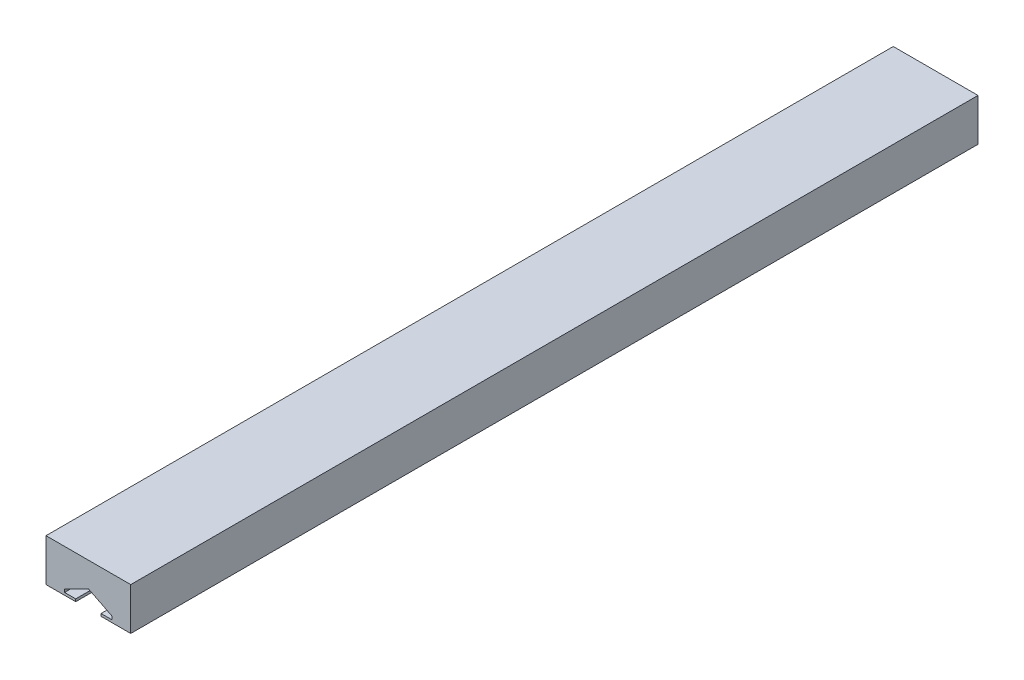
ISO-10303-21;
HEADER;
FILE_DESCRIPTION(('STEP AP214'),'2;1');
FILE_NAME('part.step','',(''),(''),'','','');
FILE_SCHEMA(('AUTOMOTIVE_DESIGN { 1 0 10303 214 1 1 1 1 }'));
ENDSEC;
DATA;
#1=APPLICATION_CONTEXT('core data for automotive mechanical design processes');
#2=APPLICATION_PROTOCOL_DEFINITION('international standard','automotive_design',2000,#1);
#3=PRODUCT_CONTEXT('',#1,'mechanical');
#4=PRODUCT('Part','Part','',(#3));
#5=PRODUCT_RELATED_PRODUCT_CATEGORY('part','',(#4));
#6=PRODUCT_DEFINITION_FORMATION('','',#4);
#7=PRODUCT_DEFINITION_CONTEXT('part definition',#1,'design');
#8=PRODUCT_DEFINITION('design','',#6,#7);
#9=PRODUCT_DEFINITION_SHAPE('','',#8);
#10=(LENGTH_UNIT() NAMED_UNIT(*) SI_UNIT(.MILLI.,.METRE.));
#11=(NAMED_UNIT(*) PLANE_ANGLE_UNIT() SI_UNIT($,.RADIAN.));
#12=(NAMED_UNIT(*) SI_UNIT($,.STERADIAN.) SOLID_ANGLE_UNIT());
#13=UNCERTAINTY_MEASURE_WITH_UNIT(LENGTH_MEASURE(1.E-05),#10,'distance_accuracy_value','');
#14=(GEOMETRIC_REPRESENTATION_CONTEXT(3) GLOBAL_UNCERTAINTY_ASSIGNED_CONTEXT((#13)) GLOBAL_UNIT_ASSIGNED_CONTEXT((#10,
#11,#12)) REPRESENTATION_CONTEXT('',''));
#15=CARTESIAN_POINT('',(0.,0.,0.));
#16=DIRECTION('',(0.,0.,1.));
#17=DIRECTION('',(1.,0.,0.));
#18=AXIS2_PLACEMENT_3D('',#15,#16,#17);
#19=CARTESIAN_POINT('',(-10.,-5.,200.));
#20=DIRECTION('',(1.,0.,0.));
#21=DIRECTION('',(0.,1.,0.));
#22=AXIS2_PLACEMENT_3D('',#19,#20,#21);
#23=PLANE('',#22);
#24=DIRECTION('',(0.,-1.,0.));
#25=VECTOR('',#24,1.);
#26=CARTESIAN_POINT('',(-10.,-5.,0.));
#27=LINE('',#26,#25);
#28=CARTESIAN_POINT('',(-10.,5.,0.));
#29=VERTEX_POINT('',#28);
#30=CARTESIAN_POINT('',(-10.,-5.,0.));
#31=VERTEX_POINT('',#30);
#32=EDGE_CURVE('E170',#29,#31,#27,.T.);
#33=ORIENTED_EDGE('',*,*,#32,.T.);
#34=DIRECTION('',(0.,0.,-1.));
#35=VECTOR('',#34,1.);
#36=CARTESIAN_POINT('',(-10.,-5.,200.));
#37=LINE('',#36,#35);
#38=CARTESIAN_POINT('',(-10.,-5.,200.));
#39=VERTEX_POINT('',#38);
#40=EDGE_CURVE('E11',#39,#31,#37,.T.);
#41=ORIENTED_EDGE('',*,*,#40,.F.);
#42=DIRECTION('',(0.,-1.,0.));
#43=VECTOR('',#42,1.);
#44=CARTESIAN_POINT('',(-10.,-5.,200.));
#45=LINE('',#44,#43);
#46=CARTESIAN_POINT('',(-10.,5.,200.));
#47=VERTEX_POINT('',#46);
#48=EDGE_CURVE('E207',#47,#39,#45,.T.);
#49=ORIENTED_EDGE('',*,*,#48,.F.);
#50=DIRECTION('',(0.,0.,-1.));
#51=VECTOR('',#50,1.);
#52=CARTESIAN_POINT('',(-10.,5.,200.));
#53=LINE('',#52,#51);
#54=EDGE_CURVE('E166',#47,#29,#53,.T.);
#55=ORIENTED_EDGE('',*,*,#54,.T.);
#56=EDGE_LOOP('',(#33,#41,#49,#55));
#57=FACE_BOUND('',#56,.T.);
#58=ADVANCED_FACE('F39',(#57),#23,.F.);
#59=CARTESIAN_POINT('',(-2.99117325571684,-5.,200.));
#60=DIRECTION('',(0.,1.,0.));
#61=DIRECTION('',(-1.,0.,0.));
#62=AXIS2_PLACEMENT_3D('',#59,#60,#61);
#63=PLANE('',#62);
#64=DIRECTION('',(1.,0.,0.));
#65=VECTOR('',#64,1.);
#66=CARTESIAN_POINT('',(-2.99117325571684,-5.,0.));
#67=LINE('',#66,#65);
#68=CARTESIAN_POINT('',(-2.99117325571684,-5.,0.));
#69=VERTEX_POINT('',#68);
#70=EDGE_CURVE('E174',#31,#69,#67,.T.);
#71=ORIENTED_EDGE('',*,*,#70,.T.);
#72=DIRECTION('',(0.,0.,-1.));
#73=VECTOR('',#72,1.);
#74=CARTESIAN_POINT('',(-2.99117325571684,-5.,200.));
#75=LINE('',#74,#73);
#76=CARTESIAN_POINT('',(-2.99117325571684,-5.,200.));
#77=VERTEX_POINT('',#76);
#78=EDGE_CURVE('E48',#77,#69,#75,.T.);
#79=ORIENTED_EDGE('',*,*,#78,.F.);
#80=DIRECTION('',(1.,0.,0.));
#81=VECTOR('',#80,1.);
#82=CARTESIAN_POINT('',(-2.99117325571684,-5.,200.));
#83=LINE('',#82,#81);
#84=EDGE_CURVE('E114',#39,#77,#83,.T.);
#85=ORIENTED_EDGE('',*,*,#84,.F.);
#86=ORIENTED_EDGE('',*,*,#40,.T.);
#87=EDGE_LOOP('',(#71,#79,#85,#86));
#88=FACE_BOUND('',#87,.T.);
#89=ADVANCED_FACE('F308',(#88),#63,.F.);
#90=CARTESIAN_POINT('',(-2.99117325571684,-5.,200.));
#91=DIRECTION('',(-1.,0.,0.));
#92=DIRECTION('',(0.,0.,1.));
#93=AXIS2_PLACEMENT_3D('',#90,#91,#92);
#94=PLANE('',#93);
#95=DIRECTION('',(0.,1.,0.));
#96=VECTOR('',#95,1.);
#97=CARTESIAN_POINT('',(-2.99117325571684,-5.,0.));
#98=LINE('',#97,#96);
#99=CARTESIAN_POINT('',(-2.99117325571684,-4.4150657523741,0.));
#100=VERTEX_POINT('',#99);
#101=EDGE_CURVE('E177',#69,#100,#98,.T.);
#102=ORIENTED_EDGE('',*,*,#101,.T.);
#103=DIRECTION('',(0.,0.,-1.));
#104=VECTOR('',#103,1.);
#105=CARTESIAN_POINT('',(-2.99117325571684,-4.4150657523741,200.));
#106=LINE('',#105,#104);
#107=CARTESIAN_POINT('',(-2.99117325571684,-4.4150657523741,200.));
#108=VERTEX_POINT('',#107);
#109=EDGE_CURVE('E238',#108,#100,#106,.T.);
#110=ORIENTED_EDGE('',*,*,#109,.F.);
#111=DIRECTION('',(0.,1.,0.));
#112=VECTOR('',#111,1.);
#113=CARTESIAN_POINT('',(-2.99117325571684,-5.,200.));
#114=LINE('',#113,#112);
#115=EDGE_CURVE('E248',#77,#108,#114,.T.);
#116=ORIENTED_EDGE('',*,*,#115,.F.);
#117=ORIENTED_EDGE('',*,*,#78,.T.);
#118=EDGE_LOOP('',(#102,#110,#116,#117));
#119=FACE_BOUND('',#118,.T.);
#120=ADVANCED_FACE('F246',(#119),#94,.F.);
#121=CARTESIAN_POINT('',(-2.99117325571684,-4.4150657523741,200.));
#122=DIRECTION('',(0.,-1.,0.));
#123=DIRECTION('',(0.,0.,-1.));
#124=AXIS2_PLACEMENT_3D('',#121,#122,#123);
#125=PLANE('',#124);
#126=DIRECTION('',(-1.,0.,0.));
#127=VECTOR('',#126,1.);
#128=CARTESIAN_POINT('',(-2.99117325571684,-4.4150657523741,0.));
#129=LINE('',#128,#127);
#130=CARTESIAN_POINT('',(-5.6161355472875,-4.4150657523741,0.));
#131=VERTEX_POINT('',#130);
#132=EDGE_CURVE('E180',#100,#131,#129,.T.);
#133=ORIENTED_EDGE('',*,*,#132,.T.);
#134=DIRECTION('',(0.,0.,-1.));
#135=VECTOR('',#134,1.);
#136=CARTESIAN_POINT('',(-5.6161355472875,-4.4150657523741,200.));
#137=LINE('',#136,#135);
#138=CARTESIAN_POINT('',(-5.6161355472875,-4.4150657523741,200.));
#139=VERTEX_POINT('',#138);
#140=EDGE_CURVE('E234',#139,#131,#137,.T.);
#141=ORIENTED_EDGE('',*,*,#140,.F.);
#142=DIRECTION('',(-1.,0.,0.));
#143=VECTOR('',#142,1.);
#144=CARTESIAN_POINT('',(-2.99117325571684,-4.4150657523741,200.));
#145=LINE('',#144,#143);
#146=EDGE_CURVE('E267',#108,#139,#145,.T.);
#147=ORIENTED_EDGE('',*,*,#146,.F.);
#148=ORIENTED_EDGE('',*,*,#109,.T.);
#149=EDGE_LOOP('',(#133,#141,#147,#148));
#150=FACE_BOUND('',#149,.T.);
#151=ADVANCED_FACE('F257',(#150),#125,.F.);
#152=CARTESIAN_POINT('',(-5.6161355472875,-4.4150657523741,200.));
#153=DIRECTION('',(-1.,0.,0.));
#154=DIRECTION('',(0.,-1.,0.));
#155=AXIS2_PLACEMENT_3D('',#152,#153,#154);
#156=PLANE('',#155);
#157=DIRECTION('',(0.,1.,0.));
#158=VECTOR('',#157,1.);
#159=CARTESIAN_POINT('',(-5.6161355472875,-4.4150657523741,0.));
#160=LINE('',#159,#158);
#161=CARTESIAN_POINT('',(-5.6161355472875,-3.66682754740484,0.));
#162=VERTEX_POINT('',#161);
#163=EDGE_CURVE('E183',#131,#162,#160,.T.);
#164=ORIENTED_EDGE('',*,*,#163,.T.);
#165=DIRECTION('',(0.,0.,-1.));
#166=VECTOR('',#165,1.);
#167=CARTESIAN_POINT('',(-5.6161355472875,-3.66682754740484,200.));
#168=LINE('',#167,#166);
#169=CARTESIAN_POINT('',(-5.6161355472875,-3.66682754740484,200.));
#170=VERTEX_POINT('',#169);
#171=EDGE_CURVE('E230',#170,#162,#168,.T.);
#172=ORIENTED_EDGE('',*,*,#171,.F.);
#173=DIRECTION('',(0.,1.,0.));
#174=VECTOR('',#173,1.);
#175=CARTESIAN_POINT('',(-5.6161355472875,-4.4150657523741,200.));
#176=LINE('',#175,#174);
#177=EDGE_CURVE('E263',#139,#170,#176,.T.);
#178=ORIENTED_EDGE('',*,*,#177,.F.);
#179=ORIENTED_EDGE('',*,*,#140,.T.);
#180=EDGE_LOOP('',(#164,#172,#178,#179));
#181=FACE_BOUND('',#180,.T.);
#182=ADVANCED_FACE('F261',(#181),#156,.F.);
#183=CARTESIAN_POINT('',(-5.6161355472875,-3.66682754740484,200.));
#184=DIRECTION('',(-0.447213595499958,0.894427190999916,0.));
#185=DIRECTION('',(-0.894427190999916,-0.447213595499958,0.));
#186=AXIS2_PLACEMENT_3D('',#183,#184,#185);
#187=PLANE('',#186);
#188=DIRECTION('',(0.894427190999916,0.447213595499958,0.));
#189=VECTOR('',#188,1.);
#190=CARTESIAN_POINT('',(-5.6161355472875,-3.66682754740484,0.));
#191=LINE('',#190,#189);
#192=CARTESIAN_POINT('',(0.,-0.858759773761084,0.));
#193=VERTEX_POINT('',#192);
#194=EDGE_CURVE('E186',#162,#193,#191,.T.);
#195=ORIENTED_EDGE('',*,*,#194,.T.);
#196=DIRECTION('',(0.,0.,-1.));
#197=VECTOR('',#196,1.);
#198=CARTESIAN_POINT('',(0.,-0.858759773761084,200.));
#199=LINE('',#198,#197);
#200=CARTESIAN_POINT('',(0.,-0.858759773761084,200.));
#201=VERTEX_POINT('',#200);
#202=EDGE_CURVE('E226',#201,#193,#199,.T.);
#203=ORIENTED_EDGE('',*,*,#202,.F.);
#204=DIRECTION('',(0.894427190999916,0.447213595499958,0.));
#205=VECTOR('',#204,1.);
#206=CARTESIAN_POINT('',(-5.6161355472875,-3.66682754740484,200.));
#207=LINE('',#206,#205);
#208=EDGE_CURVE('E266',#170,#201,#207,.T.);
#209=ORIENTED_EDGE('',*,*,#208,.F.);
#210=ORIENTED_EDGE('',*,*,#171,.T.);
#211=EDGE_LOOP('',(#195,#203,#209,#210));
#212=FACE_BOUND('',#211,.T.);
#213=ADVANCED_FACE('F321',(#212),#187,.F.);
#214=CARTESIAN_POINT('',(5.6161355472875,-3.66682754740484,200.));
#215=DIRECTION('',(0.447213595499958,0.894427190999916,0.));
#216=DIRECTION('',(-0.894427190999916,0.447213595499958,0.));
#217=AXIS2_PLACEMENT_3D('',#214,#215,#216);
#218=PLANE('',#217);
#219=DIRECTION('',(0.894427190999916,-0.447213595499958,0.));
#220=VECTOR('',#219,1.);
#221=CARTESIAN_POINT('',(5.6161355472875,-3.66682754740484,0.));
#222=LINE('',#221,#220);
#223=CARTESIAN_POINT('',(5.6161355472875,-3.66682754740484,0.));
#224=VERTEX_POINT('',#223);
#225=EDGE_CURVE('E189',#193,#224,#222,.T.);
#226=ORIENTED_EDGE('',*,*,#225,.T.);
#227=DIRECTION('',(0.,0.,-1.));
#228=VECTOR('',#227,1.);
#229=CARTESIAN_POINT('',(5.6161355472875,-3.66682754740484,200.));
#230=LINE('',#229,#228);
#231=CARTESIAN_POINT('',(5.6161355472875,-3.66682754740484,200.));
#232=VERTEX_POINT('',#231);
#233=EDGE_CURVE('E222',#232,#224,#230,.T.);
#234=ORIENTED_EDGE('',*,*,#233,.F.);
#235=DIRECTION('',(0.894427190999916,-0.447213595499958,0.));
#236=VECTOR('',#235,1.);
#237=CARTESIAN_POINT('',(5.6161355472875,-3.66682754740484,200.));
#238=LINE('',#237,#236);
#239=EDGE_CURVE('E271',#201,#232,#238,.T.);
#240=ORIENTED_EDGE('',*,*,#239,.F.);
#241=ORIENTED_EDGE('',*,*,#202,.T.);
#242=EDGE_LOOP('',(#226,#234,#240,#241));
#243=FACE_BOUND('',#242,.T.);
#244=ADVANCED_FACE('F324',(#243),#218,.F.);
#245=CARTESIAN_POINT('',(5.6161355472875,-4.4150657523741,200.));
#246=DIRECTION('',(1.,0.,0.));
#247=DIRECTION('',(0.,1.,0.));
#248=AXIS2_PLACEMENT_3D('',#245,#246,#247);
#249=PLANE('',#248);
#250=DIRECTION('',(0.,-1.,0.));
#251=VECTOR('',#250,1.);
#252=CARTESIAN_POINT('',(5.6161355472875,-4.4150657523741,0.));
#253=LINE('',#252,#251);
#254=CARTESIAN_POINT('',(5.6161355472875,-4.4150657523741,0.));
#255=VERTEX_POINT('',#254);
#256=EDGE_CURVE('E192',#224,#255,#253,.T.);
#257=ORIENTED_EDGE('',*,*,#256,.T.);
#258=DIRECTION('',(0.,0.,-1.));
#259=VECTOR('',#258,1.);
#260=CARTESIAN_POINT('',(5.6161355472875,-4.4150657523741,200.));
#261=LINE('',#260,#259);
#262=CARTESIAN_POINT('',(5.6161355472875,-4.4150657523741,200.));
#263=VERTEX_POINT('',#262);
#264=EDGE_CURVE('E218',#263,#255,#261,.T.);
#265=ORIENTED_EDGE('',*,*,#264,.F.);
#266=DIRECTION('',(0.,-1.,0.));
#267=VECTOR('',#266,1.);
#268=CARTESIAN_POINT('',(5.6161355472875,-4.4150657523741,200.));
#269=LINE('',#268,#267);
#270=EDGE_CURVE('E278',#232,#263,#269,.T.);
#271=ORIENTED_EDGE('',*,*,#270,.F.);
#272=ORIENTED_EDGE('',*,*,#233,.T.);
#273=EDGE_LOOP('',(#257,#265,#271,#272));
#274=FACE_BOUND('',#273,.T.);
#275=ADVANCED_FACE('F328',(#274),#249,.F.);
#276=CARTESIAN_POINT('',(2.99117325571684,-4.4150657523741,200.));
#277=DIRECTION('',(0.,-1.,0.));
#278=DIRECTION('',(1.,0.,0.));
#279=AXIS2_PLACEMENT_3D('',#276,#277,#278);
#280=PLANE('',#279);
#281=DIRECTION('',(-1.,0.,0.));
#282=VECTOR('',#281,1.);
#283=CARTESIAN_POINT('',(2.99117325571684,-4.4150657523741,0.));
#284=LINE('',#283,#282);
#285=CARTESIAN_POINT('',(2.99117325571684,-4.4150657523741,0.));
#286=VERTEX_POINT('',#285);
#287=EDGE_CURVE('E195',#255,#286,#284,.T.);
#288=ORIENTED_EDGE('',*,*,#287,.T.);
#289=DIRECTION('',(0.,0.,-1.));
#290=VECTOR('',#289,1.);
#291=CARTESIAN_POINT('',(2.99117325571684,-4.4150657523741,200.));
#292=LINE('',#291,#290);
#293=CARTESIAN_POINT('',(2.99117325571684,-4.4150657523741,200.));
#294=VERTEX_POINT('',#293);
#295=EDGE_CURVE('E214',#294,#286,#292,.T.);
#296=ORIENTED_EDGE('',*,*,#295,.F.);
#297=DIRECTION('',(-1.,0.,0.));
#298=VECTOR('',#297,1.);
#299=CARTESIAN_POINT('',(2.99117325571684,-4.4150657523741,200.));
#300=LINE('',#299,#298);
#301=EDGE_CURVE('E281',#263,#294,#300,.T.);
#302=ORIENTED_EDGE('',*,*,#301,.F.);
#303=ORIENTED_EDGE('',*,*,#264,.T.);
#304=EDGE_LOOP('',(#288,#296,#302,#303));
#305=FACE_BOUND('',#304,.T.);
#306=ADVANCED_FACE('F289',(#305),#280,.F.);
#307=CARTESIAN_POINT('',(2.99117325571684,-5.,200.));
#308=DIRECTION('',(1.,0.,0.));
#309=DIRECTION('',(0.,1.,0.));
#310=AXIS2_PLACEMENT_3D('',#307,#308,#309);
#311=PLANE('',#310);
#312=DIRECTION('',(0.,-1.,0.));
#313=VECTOR('',#312,1.);
#314=CARTESIAN_POINT('',(2.99117325571684,-5.,0.));
#315=LINE('',#314,#313);
#316=CARTESIAN_POINT('',(2.99117325571684,-5.,0.));
#317=VERTEX_POINT('',#316);
#318=EDGE_CURVE('E198',#286,#317,#315,.T.);
#319=ORIENTED_EDGE('',*,*,#318,.T.);
#320=DIRECTION('',(0.,0.,-1.));
#321=VECTOR('',#320,1.);
#322=CARTESIAN_POINT('',(2.99117325571684,-5.,200.));
#323=LINE('',#322,#321);
#324=CARTESIAN_POINT('',(2.99117325571684,-5.,200.));
#325=VERTEX_POINT('',#324);
#326=EDGE_CURVE('E159',#325,#317,#323,.T.);
#327=ORIENTED_EDGE('',*,*,#326,.F.);
#328=DIRECTION('',(0.,-1.,0.));
#329=VECTOR('',#328,1.);
#330=CARTESIAN_POINT('',(2.99117325571684,-5.,200.));
#331=LINE('',#330,#329);
#332=EDGE_CURVE('E148',#294,#325,#331,.T.);
#333=ORIENTED_EDGE('',*,*,#332,.F.);
#334=ORIENTED_EDGE('',*,*,#295,.T.);
#335=EDGE_LOOP('',(#319,#327,#333,#334));
#336=FACE_BOUND('',#335,.T.);
#337=ADVANCED_FACE('F293',(#336),#311,.F.);
#338=CARTESIAN_POINT('',(10.,-5.,200.));
#339=DIRECTION('',(0.,1.,0.));
#340=DIRECTION('',(-1.,0.,0.));
#341=AXIS2_PLACEMENT_3D('',#338,#339,#340);
#342=PLANE('',#341);
#343=DIRECTION('',(1.,0.,0.));
#344=VECTOR('',#343,1.);
#345=CARTESIAN_POINT('',(10.,-5.,0.));
#346=LINE('',#345,#344);
#347=CARTESIAN_POINT('',(10.,-5.,0.));
#348=VERTEX_POINT('',#347);
#349=EDGE_CURVE('E157',#317,#348,#346,.T.);
#350=ORIENTED_EDGE('',*,*,#349,.T.);
#351=DIRECTION('',(0.,0.,-1.));
#352=VECTOR('',#351,1.);
#353=CARTESIAN_POINT('',(10.,-5.,200.));
#354=LINE('',#353,#352);
#355=CARTESIAN_POINT('',(10.,-5.,200.));
#356=VERTEX_POINT('',#355);
#357=EDGE_CURVE('E154',#356,#348,#354,.T.);
#358=ORIENTED_EDGE('',*,*,#357,.F.);
#359=DIRECTION('',(1.,0.,0.));
#360=VECTOR('',#359,1.);
#361=CARTESIAN_POINT('',(10.,-5.,200.));
#362=LINE('',#361,#360);
#363=EDGE_CURVE('E142',#325,#356,#362,.T.);
#364=ORIENTED_EDGE('',*,*,#363,.F.);
#365=ORIENTED_EDGE('',*,*,#326,.T.);
#366=EDGE_LOOP('',(#350,#358,#364,#365));
#367=FACE_BOUND('',#366,.T.);
#368=ADVANCED_FACE('F155',(#367),#342,.F.);
#369=CARTESIAN_POINT('',(10.,-5.,200.));
#370=DIRECTION('',(-1.,0.,0.));
#371=DIRECTION('',(0.,-1.,0.));
#372=AXIS2_PLACEMENT_3D('',#369,#370,#371);
#373=PLANE('',#372);
#374=DIRECTION('',(0.,1.,0.));
#375=VECTOR('',#374,1.);
#376=CARTESIAN_POINT('',(10.,-5.,0.));
#377=LINE('',#376,#375);
#378=CARTESIAN_POINT('',(10.,5.,0.));
#379=VERTEX_POINT('',#378);
#380=EDGE_CURVE('E100',#348,#379,#377,.T.);
#381=ORIENTED_EDGE('',*,*,#380,.T.);
#382=DIRECTION('',(0.,0.,-1.));
#383=VECTOR('',#382,1.);
#384=CARTESIAN_POINT('',(10.,5.,200.));
#385=LINE('',#384,#383);
#386=CARTESIAN_POINT('',(10.,5.,200.));
#387=VERTEX_POINT('',#386);
#388=EDGE_CURVE('E160',#387,#379,#385,.T.);
#389=ORIENTED_EDGE('',*,*,#388,.F.);
#390=DIRECTION('',(0.,1.,0.));
#391=VECTOR('',#390,1.);
#392=CARTESIAN_POINT('',(10.,-5.,200.));
#393=LINE('',#392,#391);
#394=EDGE_CURVE('E146',#356,#387,#393,.T.);
#395=ORIENTED_EDGE('',*,*,#394,.F.);
#396=ORIENTED_EDGE('',*,*,#357,.T.);
#397=EDGE_LOOP('',(#381,#389,#395,#396));
#398=FACE_BOUND('',#397,.T.);
#399=ADVANCED_FACE('F162',(#398),#373,.F.);
#400=CARTESIAN_POINT('',(10.,5.,200.));
#401=DIRECTION('',(0.,-1.,0.));
#402=DIRECTION('',(1.,0.,0.));
#403=AXIS2_PLACEMENT_3D('',#400,#401,#402);
#404=PLANE('',#403);
#405=DIRECTION('',(-1.,0.,0.));
#406=VECTOR('',#405,1.);
#407=CARTESIAN_POINT('',(10.,5.,0.));
#408=LINE('',#407,#406);
#409=EDGE_CURVE('E106',#379,#29,#408,.T.);
#410=ORIENTED_EDGE('',*,*,#409,.T.);
#411=ORIENTED_EDGE('',*,*,#54,.F.);
#412=DIRECTION('',(-1.,0.,0.));
#413=VECTOR('',#412,1.);
#414=CARTESIAN_POINT('',(10.,5.,200.));
#415=LINE('',#414,#413);
#416=EDGE_CURVE('E56',#387,#47,#415,.T.);
#417=ORIENTED_EDGE('',*,*,#416,.F.);
#418=ORIENTED_EDGE('',*,*,#388,.T.);
#419=EDGE_LOOP('',(#410,#411,#417,#418));
#420=FACE_BOUND('',#419,.T.);
#421=ADVANCED_FACE('F297',(#420),#404,.F.);
#422=CARTESIAN_POINT('',(0.,0.,200.));
#423=DIRECTION('',(0.,0.,1.));
#424=DIRECTION('',(1.,0.,0.));
#425=AXIS2_PLACEMENT_3D('',#422,#423,#424);
#426=PLANE('',#425);
#427=ORIENTED_EDGE('',*,*,#48,.T.);
#428=ORIENTED_EDGE('',*,*,#84,.T.);
#429=ORIENTED_EDGE('',*,*,#115,.T.);
#430=ORIENTED_EDGE('',*,*,#146,.T.);
#431=ORIENTED_EDGE('',*,*,#177,.T.);
#432=ORIENTED_EDGE('',*,*,#208,.T.);
#433=ORIENTED_EDGE('',*,*,#239,.T.);
#434=ORIENTED_EDGE('',*,*,#270,.T.);
#435=ORIENTED_EDGE('',*,*,#301,.T.);
#436=ORIENTED_EDGE('',*,*,#332,.T.);
#437=ORIENTED_EDGE('',*,*,#363,.T.);
#438=ORIENTED_EDGE('',*,*,#394,.T.);
#439=ORIENTED_EDGE('',*,*,#416,.T.);
#440=EDGE_LOOP('',(#427,#428,#429,#430,#431,#432,#433,#434,#435,#436,#437,#438,#439));
#441=FACE_BOUND('',#440,.T.);
#442=ADVANCED_FACE('F144',(#441),#426,.T.);
#443=CARTESIAN_POINT('',(0.,0.,0.));
#444=DIRECTION('',(0.,0.,1.));
#445=DIRECTION('',(1.,0.,0.));
#446=AXIS2_PLACEMENT_3D('',#443,#444,#445);
#447=PLANE('',#446);
#448=ORIENTED_EDGE('',*,*,#32,.F.);
#449=ORIENTED_EDGE('',*,*,#409,.F.);
#450=ORIENTED_EDGE('',*,*,#380,.F.);
#451=ORIENTED_EDGE('',*,*,#349,.F.);
#452=ORIENTED_EDGE('',*,*,#318,.F.);
#453=ORIENTED_EDGE('',*,*,#287,.F.);
#454=ORIENTED_EDGE('',*,*,#256,.F.);
#455=ORIENTED_EDGE('',*,*,#225,.F.);
#456=ORIENTED_EDGE('',*,*,#194,.F.);
#457=ORIENTED_EDGE('',*,*,#163,.F.);
#458=ORIENTED_EDGE('',*,*,#132,.F.);
#459=ORIENTED_EDGE('',*,*,#101,.F.);
#460=ORIENTED_EDGE('',*,*,#70,.F.);
#461=EDGE_LOOP('',(#448,#449,#450,#451,#452,#453,#454,#455,#456,#457,#458,#459,#460));
#462=FACE_BOUND('',#461,.T.);
#463=ADVANCED_FACE('F252',(#462),#447,.F.);
#464=CLOSED_SHELL('',(#58,#89,#120,#151,#182,#213,#244,#275,#306,#337,#368,#399,#421,#442,#463));
#465=MANIFOLD_SOLID_BREP('B2',#464);
#466=ADVANCED_BREP_SHAPE_REPRESENTATION('',(#18,#465),#14);
#467=SHAPE_DEFINITION_REPRESENTATION(#9,#466);
ENDSEC;
END-ISO-10303-21;
